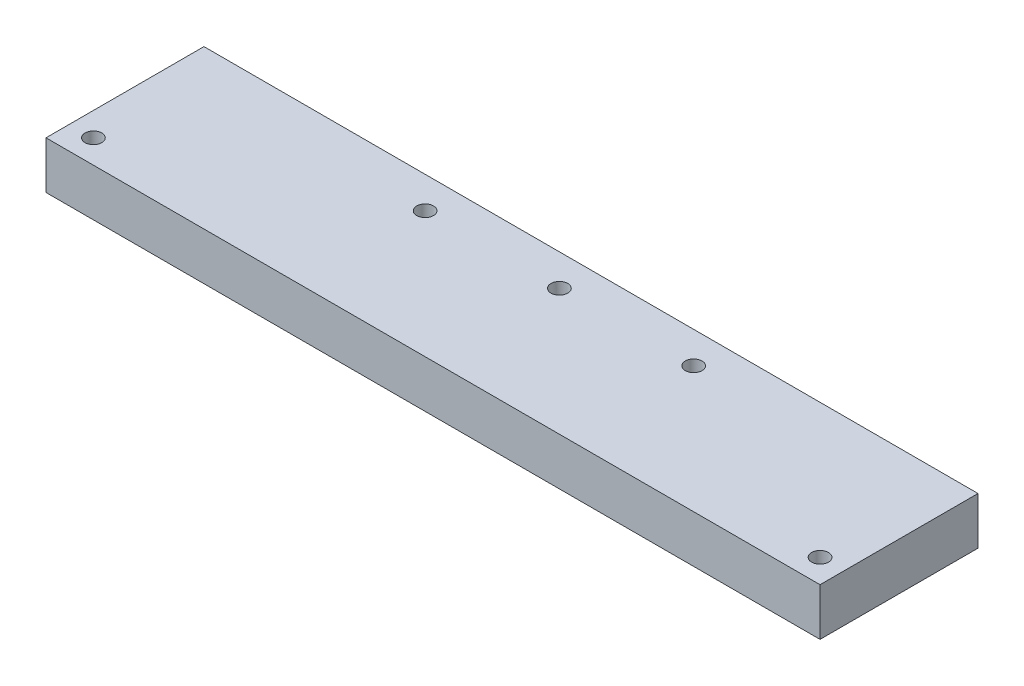
ISO-10303-21;
HEADER;
FILE_DESCRIPTION(('STEP AP214'),'2;1');
FILE_NAME('part.step','',(''),(''),'','','');
FILE_SCHEMA(('AUTOMOTIVE_DESIGN { 1 0 10303 214 1 1 1 1 }'));
ENDSEC;
DATA;
#1=APPLICATION_CONTEXT('core data for automotive mechanical design processes');
#2=APPLICATION_PROTOCOL_DEFINITION('international standard','automotive_design',2000,#1);
#3=PRODUCT_CONTEXT('',#1,'mechanical');
#4=PRODUCT('Part','Part','',(#3));
#5=PRODUCT_RELATED_PRODUCT_CATEGORY('part','',(#4));
#6=PRODUCT_DEFINITION_FORMATION('','',#4);
#7=PRODUCT_DEFINITION_CONTEXT('part definition',#1,'design');
#8=PRODUCT_DEFINITION('design','',#6,#7);
#9=PRODUCT_DEFINITION_SHAPE('','',#8);
#10=(LENGTH_UNIT() NAMED_UNIT(*) SI_UNIT(.MILLI.,.METRE.));
#11=(NAMED_UNIT(*) PLANE_ANGLE_UNIT() SI_UNIT($,.RADIAN.));
#12=(NAMED_UNIT(*) SI_UNIT($,.STERADIAN.) SOLID_ANGLE_UNIT());
#13=UNCERTAINTY_MEASURE_WITH_UNIT(LENGTH_MEASURE(1.E-05),#10,'distance_accuracy_value','');
#14=(GEOMETRIC_REPRESENTATION_CONTEXT(3) GLOBAL_UNCERTAINTY_ASSIGNED_CONTEXT((#13)) GLOBAL_UNIT_ASSIGNED_CONTEXT((#10,
#11,#12)) REPRESENTATION_CONTEXT('',''));
#15=CARTESIAN_POINT('',(0.,0.,0.));
#16=DIRECTION('',(0.,0.,1.));
#17=DIRECTION('',(1.,0.,0.));
#18=AXIS2_PLACEMENT_3D('',#15,#16,#17);
#19=CARTESIAN_POINT('',(-155.575,9.525,31.75));
#20=DIRECTION('',(-1.,0.,0.));
#21=DIRECTION('',(0.,0.,1.));
#22=AXIS2_PLACEMENT_3D('',#19,#20,#21);
#23=PLANE('',#22);
#24=DIRECTION('',(0.,0.,-1.));
#25=VECTOR('',#24,1.);
#26=CARTESIAN_POINT('',(-155.575,-9.525,31.75));
#27=LINE('',#26,#25);
#28=CARTESIAN_POINT('',(-155.575,-9.525,31.75));
#29=VERTEX_POINT('',#28);
#30=CARTESIAN_POINT('',(-155.575,-9.525,-31.75));
#31=VERTEX_POINT('',#30);
#32=EDGE_CURVE('E148',#29,#31,#27,.T.);
#33=ORIENTED_EDGE('',*,*,#32,.F.);
#34=DIRECTION('',(0.,-1.,0.));
#35=VECTOR('',#34,1.);
#36=CARTESIAN_POINT('',(-155.575,9.525,31.75));
#37=LINE('',#36,#35);
#38=CARTESIAN_POINT('',(-155.575,9.525,31.75));
#39=VERTEX_POINT('',#38);
#40=EDGE_CURVE('E11',#39,#29,#37,.T.);
#41=ORIENTED_EDGE('',*,*,#40,.F.);
#42=DIRECTION('',(0.,0.,-1.));
#43=VECTOR('',#42,1.);
#44=CARTESIAN_POINT('',(-155.575,9.525,31.75));
#45=LINE('',#44,#43);
#46=CARTESIAN_POINT('',(-155.575,9.525,-31.75));
#47=VERTEX_POINT('',#46);
#48=EDGE_CURVE('E149',#39,#47,#45,.T.);
#49=ORIENTED_EDGE('',*,*,#48,.T.);
#50=DIRECTION('',(0.,-1.,0.));
#51=VECTOR('',#50,1.);
#52=CARTESIAN_POINT('',(-155.575,9.525,-31.75));
#53=LINE('',#52,#51);
#54=EDGE_CURVE('E42',#47,#31,#53,.T.);
#55=ORIENTED_EDGE('',*,*,#54,.T.);
#56=EDGE_LOOP('',(#33,#41,#49,#55));
#57=FACE_BOUND('',#56,.T.);
#58=ADVANCED_FACE('F39',(#57),#23,.T.);
#59=CARTESIAN_POINT('',(-155.575,9.525,31.75));
#60=DIRECTION('',(0.,0.,-1.));
#61=DIRECTION('',(-1.,0.,0.));
#62=AXIS2_PLACEMENT_3D('',#59,#60,#61);
#63=PLANE('',#62);
#64=DIRECTION('',(1.,0.,0.));
#65=VECTOR('',#64,1.);
#66=CARTESIAN_POINT('',(-155.575,-9.525,31.75));
#67=LINE('',#66,#65);
#68=CARTESIAN_POINT('',(155.575,-9.525,31.75));
#69=VERTEX_POINT('',#68);
#70=EDGE_CURVE('E74',#29,#69,#67,.T.);
#71=ORIENTED_EDGE('',*,*,#70,.T.);
#72=DIRECTION('',(0.,-1.,0.));
#73=VECTOR('',#72,1.);
#74=CARTESIAN_POINT('',(155.575,9.525,31.75));
#75=LINE('',#74,#73);
#76=CARTESIAN_POINT('',(155.575,9.525,31.75));
#77=VERTEX_POINT('',#76);
#78=EDGE_CURVE('E49',#77,#69,#75,.T.);
#79=ORIENTED_EDGE('',*,*,#78,.F.);
#80=DIRECTION('',(1.,0.,0.));
#81=VECTOR('',#80,1.);
#82=CARTESIAN_POINT('',(-155.575,9.525,31.75));
#83=LINE('',#82,#81);
#84=EDGE_CURVE('E158',#39,#77,#83,.T.);
#85=ORIENTED_EDGE('',*,*,#84,.F.);
#86=ORIENTED_EDGE('',*,*,#40,.T.);
#87=EDGE_LOOP('',(#71,#79,#85,#86));
#88=FACE_BOUND('',#87,.T.);
#89=ADVANCED_FACE('F187',(#88),#63,.F.);
#90=CARTESIAN_POINT('',(155.575,9.525,31.75));
#91=DIRECTION('',(-1.,0.,0.));
#92=DIRECTION('',(0.,0.,1.));
#93=AXIS2_PLACEMENT_3D('',#90,#91,#92);
#94=PLANE('',#93);
#95=DIRECTION('',(0.,0.,-1.));
#96=VECTOR('',#95,1.);
#97=CARTESIAN_POINT('',(155.575,-9.525,31.75));
#98=LINE('',#97,#96);
#99=CARTESIAN_POINT('',(155.575,-9.525,-31.75));
#100=VERTEX_POINT('',#99);
#101=EDGE_CURVE('E168',#69,#100,#98,.T.);
#102=ORIENTED_EDGE('',*,*,#101,.T.);
#103=DIRECTION('',(0.,-1.,0.));
#104=VECTOR('',#103,1.);
#105=CARTESIAN_POINT('',(155.575,9.525,-31.75));
#106=LINE('',#105,#104);
#107=CARTESIAN_POINT('',(155.575,9.525,-31.75));
#108=VERTEX_POINT('',#107);
#109=EDGE_CURVE('E175',#108,#100,#106,.T.);
#110=ORIENTED_EDGE('',*,*,#109,.F.);
#111=DIRECTION('',(0.,0.,-1.));
#112=VECTOR('',#111,1.);
#113=CARTESIAN_POINT('',(155.575,9.525,31.75));
#114=LINE('',#113,#112);
#115=EDGE_CURVE('E155',#77,#108,#114,.T.);
#116=ORIENTED_EDGE('',*,*,#115,.F.);
#117=ORIENTED_EDGE('',*,*,#78,.T.);
#118=EDGE_LOOP('',(#102,#110,#116,#117));
#119=FACE_BOUND('',#118,.T.);
#120=ADVANCED_FACE('F185',(#119),#94,.F.);
#121=CARTESIAN_POINT('',(-155.575,9.525,-31.75));
#122=DIRECTION('',(0.,0.,-1.));
#123=DIRECTION('',(-1.,0.,0.));
#124=AXIS2_PLACEMENT_3D('',#121,#122,#123);
#125=PLANE('',#124);
#126=DIRECTION('',(1.,0.,0.));
#127=VECTOR('',#126,1.);
#128=CARTESIAN_POINT('',(-155.575,-9.525,-31.75));
#129=LINE('',#128,#127);
#130=EDGE_CURVE('E164',#31,#100,#129,.T.);
#131=ORIENTED_EDGE('',*,*,#130,.F.);
#132=ORIENTED_EDGE('',*,*,#54,.F.);
#133=DIRECTION('',(1.,0.,0.));
#134=VECTOR('',#133,1.);
#135=CARTESIAN_POINT('',(-155.575,9.525,-31.75));
#136=LINE('',#135,#134);
#137=EDGE_CURVE('E152',#47,#108,#136,.T.);
#138=ORIENTED_EDGE('',*,*,#137,.T.);
#139=ORIENTED_EDGE('',*,*,#109,.T.);
#140=EDGE_LOOP('',(#131,#132,#138,#139));
#141=FACE_BOUND('',#140,.T.);
#142=ADVANCED_FACE('F180',(#141),#125,.T.);
#143=CARTESIAN_POINT('',(0.,9.525,0.));
#144=DIRECTION('',(0.,-1.,0.));
#145=DIRECTION('',(0.,0.,-1.));
#146=AXIS2_PLACEMENT_3D('',#143,#144,#145);
#147=PLANE('',#146);
#148=CARTESIAN_POINT('',(-53.9750000000001,9.525,-19.05));
#149=DIRECTION('',(0.,1.,0.));
#150=DIRECTION('',(0.,0.,1.));
#151=AXIS2_PLACEMENT_3D('',#148,#149,#150);
#152=CIRCLE('',#151,3.3782);
#153=CARTESIAN_POINT('',(-53.9750000000001,9.525,-15.6718));
#154=VERTEX_POINT('',#153);
#155=EDGE_CURVE('E111',#154,#154,#152,.T.);
#156=ORIENTED_EDGE('',*,*,#155,.F.);
#157=EDGE_LOOP('',(#156));
#158=FACE_BOUND('',#157,.T.);
#159=CARTESIAN_POINT('',(0.,9.525,-19.05));
#160=DIRECTION('',(0.,1.,0.));
#161=DIRECTION('',(0.,0.,1.));
#162=AXIS2_PLACEMENT_3D('',#159,#160,#161);
#163=CIRCLE('',#162,3.3782);
#164=CARTESIAN_POINT('',(0.,9.525,-15.6718));
#165=VERTEX_POINT('',#164);
#166=EDGE_CURVE('E110',#165,#165,#163,.T.);
#167=ORIENTED_EDGE('',*,*,#166,.F.);
#168=EDGE_LOOP('',(#167));
#169=FACE_BOUND('',#168,.T.);
#170=CARTESIAN_POINT('',(53.9750000000001,9.525,-19.0500000000001));
#171=DIRECTION('',(0.,1.,0.));
#172=DIRECTION('',(0.,0.,1.));
#173=AXIS2_PLACEMENT_3D('',#170,#171,#172);
#174=CIRCLE('',#173,3.3782);
#175=CARTESIAN_POINT('',(53.9750000000001,9.525,-15.6718000000001));
#176=VERTEX_POINT('',#175);
#177=EDGE_CURVE('E124',#176,#176,#174,.T.);
#178=ORIENTED_EDGE('',*,*,#177,.F.);
#179=EDGE_LOOP('',(#178));
#180=FACE_BOUND('',#179,.T.);
#181=CARTESIAN_POINT('',(146.05,9.525,22.225));
#182=DIRECTION('',(0.,1.,0.));
#183=DIRECTION('',(0.,0.,1.));
#184=AXIS2_PLACEMENT_3D('',#181,#182,#183);
#185=CIRCLE('',#184,3.3782);
#186=CARTESIAN_POINT('',(146.05,9.525,25.6032));
#187=VERTEX_POINT('',#186);
#188=EDGE_CURVE('E132',#187,#187,#185,.T.);
#189=ORIENTED_EDGE('',*,*,#188,.F.);
#190=EDGE_LOOP('',(#189));
#191=FACE_BOUND('',#190,.T.);
#192=CARTESIAN_POINT('',(-146.05,9.525,22.225));
#193=DIRECTION('',(0.,1.,0.));
#194=DIRECTION('',(0.,0.,1.));
#195=AXIS2_PLACEMENT_3D('',#192,#193,#194);
#196=CIRCLE('',#195,3.3782);
#197=CARTESIAN_POINT('',(-146.05,9.525,25.6032));
#198=VERTEX_POINT('',#197);
#199=EDGE_CURVE('E140',#198,#198,#196,.T.);
#200=ORIENTED_EDGE('',*,*,#199,.F.);
#201=EDGE_LOOP('',(#200));
#202=FACE_BOUND('',#201,.T.);
#203=ORIENTED_EDGE('',*,*,#48,.F.);
#204=ORIENTED_EDGE('',*,*,#84,.T.);
#205=ORIENTED_EDGE('',*,*,#115,.T.);
#206=ORIENTED_EDGE('',*,*,#137,.F.);
#207=EDGE_LOOP('',(#203,#204,#205,#206));
#208=FACE_BOUND('',#207,.T.);
#209=ADVANCED_FACE('F189',(#158,#169,#180,#191,#202,#208),#147,.F.);
#210=CARTESIAN_POINT('',(0.,-9.525,0.));
#211=DIRECTION('',(0.,-1.,0.));
#212=DIRECTION('',(0.,0.,-1.));
#213=AXIS2_PLACEMENT_3D('',#210,#211,#212);
#214=PLANE('',#213);
#215=ORIENTED_EDGE('',*,*,#32,.T.);
#216=ORIENTED_EDGE('',*,*,#130,.T.);
#217=ORIENTED_EDGE('',*,*,#101,.F.);
#218=ORIENTED_EDGE('',*,*,#70,.F.);
#219=EDGE_LOOP('',(#215,#216,#217,#218));
#220=FACE_BOUND('',#219,.T.);
#221=ADVANCED_FACE('F183',(#220),#214,.T.);
#222=CARTESIAN_POINT('',(-146.05,-6.985,22.225));
#223=DIRECTION('',(0.,1.,0.));
#224=DIRECTION('',(0.,0.,1.));
#225=AXIS2_PLACEMENT_3D('',#222,#223,#224);
#226=CONICAL_SURFACE('',#225,3.3782,1.02974425867665);
#227=CARTESIAN_POINT('',(-146.05,-9.0148273431989,22.225));
#228=VERTEX_POINT('',#227);
#229=VERTEX_LOOP('',#228);
#230=FACE_BOUND('',#229,.T.);
#231=CARTESIAN_POINT('',(-146.05,-6.985,22.225));
#232=DIRECTION('',(0.,1.,0.));
#233=DIRECTION('',(0.,0.,1.));
#234=AXIS2_PLACEMENT_3D('',#231,#232,#233);
#235=CIRCLE('',#234,3.3782);
#236=CARTESIAN_POINT('',(-146.05,-6.985,25.6032));
#237=VERTEX_POINT('',#236);
#238=EDGE_CURVE('E144',#237,#237,#235,.T.);
#239=ORIENTED_EDGE('',*,*,#238,.T.);
#240=EDGE_LOOP('',(#239));
#241=FACE_BOUND('',#240,.T.);
#242=ADVANCED_FACE('F197',(#230,#241),#226,.F.);
#243=CARTESIAN_POINT('',(-146.05,9.525,22.225));
#244=DIRECTION('',(0.,1.,0.));
#245=DIRECTION('',(0.,0.,1.));
#246=AXIS2_PLACEMENT_3D('',#243,#244,#245);
#247=CYLINDRICAL_SURFACE('',#246,3.3782);
#248=ORIENTED_EDGE('',*,*,#238,.F.);
#249=EDGE_LOOP('',(#248));
#250=FACE_BOUND('',#249,.T.);
#251=ORIENTED_EDGE('',*,*,#199,.T.);
#252=EDGE_LOOP('',(#251));
#253=FACE_BOUND('',#252,.T.);
#254=ADVANCED_FACE('F236',(#250,#253),#247,.F.);
#255=CARTESIAN_POINT('',(146.05,-6.985,22.225));
#256=DIRECTION('',(0.,1.,0.));
#257=DIRECTION('',(0.,0.,1.));
#258=AXIS2_PLACEMENT_3D('',#255,#256,#257);
#259=CONICAL_SURFACE('',#258,3.3782,1.02974425867665);
#260=CARTESIAN_POINT('',(146.05,-9.0148273431989,22.225));
#261=VERTEX_POINT('',#260);
#262=VERTEX_LOOP('',#261);
#263=FACE_BOUND('',#262,.T.);
#264=CARTESIAN_POINT('',(146.05,-6.985,22.225));
#265=DIRECTION('',(0.,1.,0.));
#266=DIRECTION('',(0.,0.,1.));
#267=AXIS2_PLACEMENT_3D('',#264,#265,#266);
#268=CIRCLE('',#267,3.3782);
#269=CARTESIAN_POINT('',(146.05,-6.985,25.6032));
#270=VERTEX_POINT('',#269);
#271=EDGE_CURVE('E136',#270,#270,#268,.T.);
#272=ORIENTED_EDGE('',*,*,#271,.T.);
#273=EDGE_LOOP('',(#272));
#274=FACE_BOUND('',#273,.T.);
#275=ADVANCED_FACE('F245',(#263,#274),#259,.F.);
#276=CARTESIAN_POINT('',(146.05,9.525,22.225));
#277=DIRECTION('',(0.,1.,0.));
#278=DIRECTION('',(0.,0.,1.));
#279=AXIS2_PLACEMENT_3D('',#276,#277,#278);
#280=CYLINDRICAL_SURFACE('',#279,3.3782);
#281=ORIENTED_EDGE('',*,*,#271,.F.);
#282=EDGE_LOOP('',(#281));
#283=FACE_BOUND('',#282,.T.);
#284=ORIENTED_EDGE('',*,*,#188,.T.);
#285=EDGE_LOOP('',(#284));
#286=FACE_BOUND('',#285,.T.);
#287=ADVANCED_FACE('F255',(#283,#286),#280,.F.);
#288=CARTESIAN_POINT('',(53.9750000000001,-6.985,-19.0500000000001));
#289=DIRECTION('',(0.,1.,0.));
#290=DIRECTION('',(0.,0.,1.));
#291=AXIS2_PLACEMENT_3D('',#288,#289,#290);
#292=CONICAL_SURFACE('',#291,3.3782,1.02974425867665);
#293=CARTESIAN_POINT('',(53.975,-9.0148273431989,-19.0500000000001));
#294=VERTEX_POINT('',#293);
#295=VERTEX_LOOP('',#294);
#296=FACE_BOUND('',#295,.T.);
#297=CARTESIAN_POINT('',(53.9750000000001,-6.985,-19.0500000000001));
#298=DIRECTION('',(0.,1.,0.));
#299=DIRECTION('',(0.,0.,1.));
#300=AXIS2_PLACEMENT_3D('',#297,#298,#299);
#301=CIRCLE('',#300,3.3782);
#302=CARTESIAN_POINT('',(53.9750000000001,-6.985,-15.6718000000001));
#303=VERTEX_POINT('',#302);
#304=EDGE_CURVE('E128',#303,#303,#301,.T.);
#305=ORIENTED_EDGE('',*,*,#304,.T.);
#306=EDGE_LOOP('',(#305));
#307=FACE_BOUND('',#306,.T.);
#308=ADVANCED_FACE('F265',(#296,#307),#292,.F.);
#309=CARTESIAN_POINT('',(53.9750000000001,9.525,-19.0500000000001));
#310=DIRECTION('',(0.,1.,0.));
#311=DIRECTION('',(0.,0.,1.));
#312=AXIS2_PLACEMENT_3D('',#309,#310,#311);
#313=CYLINDRICAL_SURFACE('',#312,3.3782);
#314=ORIENTED_EDGE('',*,*,#304,.F.);
#315=EDGE_LOOP('',(#314));
#316=FACE_BOUND('',#315,.T.);
#317=ORIENTED_EDGE('',*,*,#177,.T.);
#318=EDGE_LOOP('',(#317));
#319=FACE_BOUND('',#318,.T.);
#320=ADVANCED_FACE('F275',(#316,#319),#313,.F.);
#321=CARTESIAN_POINT('',(0.,-6.985,-19.05));
#322=DIRECTION('',(0.,1.,0.));
#323=DIRECTION('',(0.,0.,1.));
#324=AXIS2_PLACEMENT_3D('',#321,#322,#323);
#325=CONICAL_SURFACE('',#324,3.3782,1.02974425867665);
#326=CARTESIAN_POINT('',(0.,-9.0148273431989,-19.05));
#327=VERTEX_POINT('',#326);
#328=VERTEX_LOOP('',#327);
#329=FACE_BOUND('',#328,.T.);
#330=CARTESIAN_POINT('',(0.,-6.985,-19.05));
#331=DIRECTION('',(0.,1.,0.));
#332=DIRECTION('',(0.,0.,1.));
#333=AXIS2_PLACEMENT_3D('',#330,#331,#332);
#334=CIRCLE('',#333,3.3782);
#335=CARTESIAN_POINT('',(0.,-6.985,-15.6718));
#336=VERTEX_POINT('',#335);
#337=EDGE_CURVE('E116',#336,#336,#334,.T.);
#338=ORIENTED_EDGE('',*,*,#337,.T.);
#339=EDGE_LOOP('',(#338));
#340=FACE_BOUND('',#339,.T.);
#341=ADVANCED_FACE('F285',(#329,#340),#325,.F.);
#342=CARTESIAN_POINT('',(0.,9.525,-19.05));
#343=DIRECTION('',(0.,1.,0.));
#344=DIRECTION('',(0.,0.,1.));
#345=AXIS2_PLACEMENT_3D('',#342,#343,#344);
#346=CYLINDRICAL_SURFACE('',#345,3.3782);
#347=ORIENTED_EDGE('',*,*,#337,.F.);
#348=EDGE_LOOP('',(#347));
#349=FACE_BOUND('',#348,.T.);
#350=ORIENTED_EDGE('',*,*,#166,.T.);
#351=EDGE_LOOP('',(#350));
#352=FACE_BOUND('',#351,.T.);
#353=ADVANCED_FACE('F103',(#349,#352),#346,.F.);
#354=CARTESIAN_POINT('',(-53.9750000000001,-6.985,-19.05));
#355=DIRECTION('',(0.,1.,0.));
#356=DIRECTION('',(0.,0.,1.));
#357=AXIS2_PLACEMENT_3D('',#354,#355,#356);
#358=CONICAL_SURFACE('',#357,3.3782,1.02974425867665);
#359=CARTESIAN_POINT('',(-53.9750000000001,-9.0148273431989,-19.05));
#360=VERTEX_POINT('',#359);
#361=VERTEX_LOOP('',#360);
#362=FACE_BOUND('',#361,.T.);
#363=CARTESIAN_POINT('',(-53.9750000000001,-6.985,-19.05));
#364=DIRECTION('',(0.,1.,0.));
#365=DIRECTION('',(0.,0.,1.));
#366=AXIS2_PLACEMENT_3D('',#363,#364,#365);
#367=CIRCLE('',#366,3.3782);
#368=CARTESIAN_POINT('',(-53.9750000000001,-6.985,-15.6718));
#369=VERTEX_POINT('',#368);
#370=EDGE_CURVE('E107',#369,#369,#367,.T.);
#371=ORIENTED_EDGE('',*,*,#370,.T.);
#372=EDGE_LOOP('',(#371));
#373=FACE_BOUND('',#372,.T.);
#374=ADVANCED_FACE('F99',(#362,#373),#358,.F.);
#375=CARTESIAN_POINT('',(-53.9750000000001,9.525,-19.05));
#376=DIRECTION('',(0.,1.,0.));
#377=DIRECTION('',(0.,0.,1.));
#378=AXIS2_PLACEMENT_3D('',#375,#376,#377);
#379=CYLINDRICAL_SURFACE('',#378,3.3782);
#380=ORIENTED_EDGE('',*,*,#370,.F.);
#381=EDGE_LOOP('',(#380));
#382=FACE_BOUND('',#381,.T.);
#383=ORIENTED_EDGE('',*,*,#155,.T.);
#384=EDGE_LOOP('',(#383));
#385=FACE_BOUND('',#384,.T.);
#386=ADVANCED_FACE('F102',(#382,#385),#379,.F.);
#387=CLOSED_SHELL('',(#58,#89,#120,#142,#209,#221,#242,#254,#275,#287,#308,#320,#341,#353,#374,#386));
#388=MANIFOLD_SOLID_BREP('B2',#387);
#389=ADVANCED_BREP_SHAPE_REPRESENTATION('',(#18,#388),#14);
#390=SHAPE_DEFINITION_REPRESENTATION(#9,#389);
ENDSEC;
END-ISO-10303-21;
